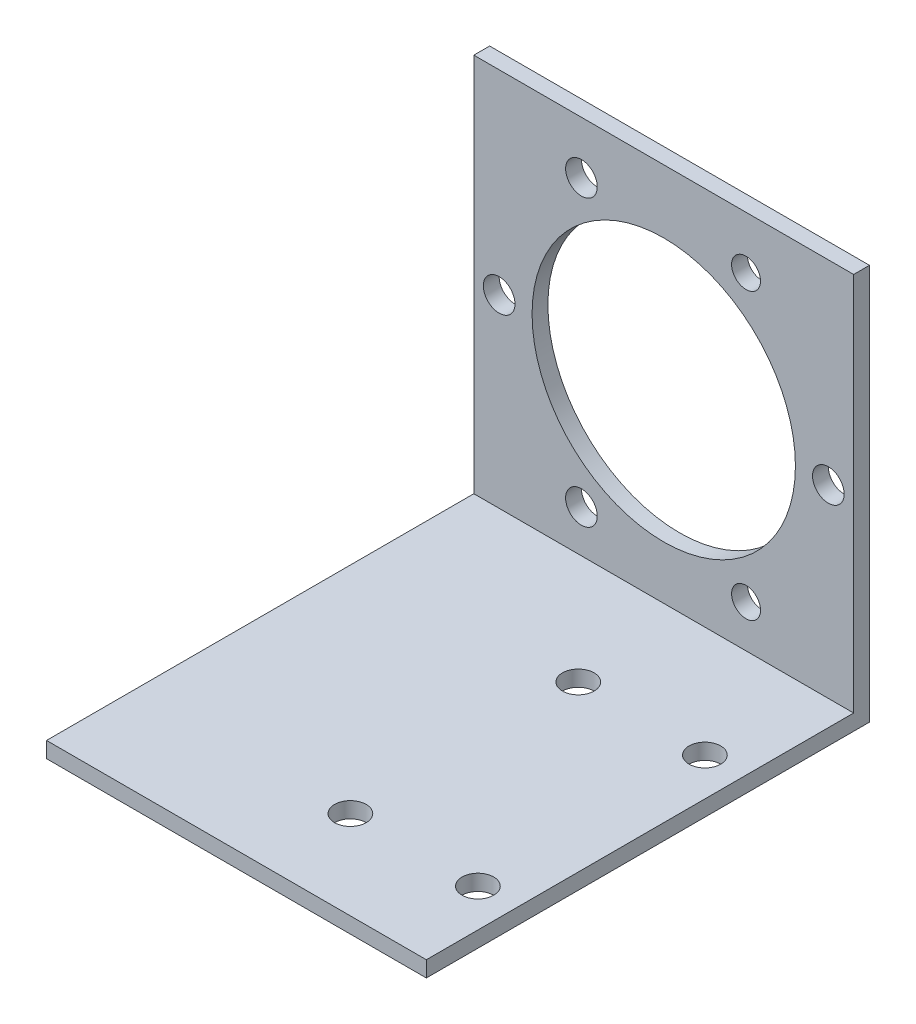
ISO-10303-21;
HEADER;
FILE_DESCRIPTION(('STEP AP214'),'2;1');
FILE_NAME('part.step','',(''),(''),'','','');
FILE_SCHEMA(('AUTOMOTIVE_DESIGN { 1 0 10303 214 1 1 1 1 }'));
ENDSEC;
DATA;
#1=APPLICATION_CONTEXT('core data for automotive mechanical design processes');
#2=APPLICATION_PROTOCOL_DEFINITION('international standard','automotive_design',2000,#1);
#3=PRODUCT_CONTEXT('',#1,'mechanical');
#4=PRODUCT('Part','Part','',(#3));
#5=PRODUCT_RELATED_PRODUCT_CATEGORY('part','',(#4));
#6=PRODUCT_DEFINITION_FORMATION('','',#4);
#7=PRODUCT_DEFINITION_CONTEXT('part definition',#1,'design');
#8=PRODUCT_DEFINITION('design','',#6,#7);
#9=PRODUCT_DEFINITION_SHAPE('','',#8);
#10=(LENGTH_UNIT() NAMED_UNIT(*) SI_UNIT(.MILLI.,.METRE.));
#11=(NAMED_UNIT(*) PLANE_ANGLE_UNIT() SI_UNIT($,.RADIAN.));
#12=(NAMED_UNIT(*) SI_UNIT($,.STERADIAN.) SOLID_ANGLE_UNIT());
#13=UNCERTAINTY_MEASURE_WITH_UNIT(LENGTH_MEASURE(1.E-05),#10,'distance_accuracy_value','');
#14=(GEOMETRIC_REPRESENTATION_CONTEXT(3) GLOBAL_UNCERTAINTY_ASSIGNED_CONTEXT((#13)) GLOBAL_UNIT_ASSIGNED_CONTEXT((#10,
#11,#12)) REPRESENTATION_CONTEXT('',''));
#15=CARTESIAN_POINT('',(0.,0.,0.));
#16=DIRECTION('',(0.,0.,1.));
#17=DIRECTION('',(1.,0.,0.));
#18=AXIS2_PLACEMENT_3D('',#15,#16,#17);
#19=CARTESIAN_POINT('',(0.,1.58749999999999,44.4499999999998));
#20=DIRECTION('',(0.,-1.,0.));
#21=DIRECTION('',(0.,0.,-1.));
#22=AXIS2_PLACEMENT_3D('',#19,#20,#21);
#23=PLANE('',#22);
#24=CARTESIAN_POINT('',(34.29,1.58750000000001,12.7));
#25=DIRECTION('',(0.,1.,0.));
#26=DIRECTION('',(0.,0.,1.));
#27=AXIS2_PLACEMENT_3D('',#24,#25,#26);
#28=CIRCLE('',#27,1.58749999999999);
#29=CARTESIAN_POINT('',(34.29,1.58750000000001,14.2875));
#30=VERTEX_POINT('',#29);
#31=EDGE_CURVE('E268',#30,#30,#28,.T.);
#32=ORIENTED_EDGE('',*,*,#31,.F.);
#33=EDGE_LOOP('',(#32));
#34=FACE_BOUND('',#33,.T.);
#35=CARTESIAN_POINT('',(21.59,1.58750000000001,12.7));
#36=DIRECTION('',(0.,1.,0.));
#37=DIRECTION('',(0.,0.,1.));
#38=AXIS2_PLACEMENT_3D('',#35,#36,#37);
#39=CIRCLE('',#38,1.58749999999999);
#40=CARTESIAN_POINT('',(21.59,1.58750000000001,14.2875));
#41=VERTEX_POINT('',#40);
#42=EDGE_CURVE('E273',#41,#41,#39,.T.);
#43=ORIENTED_EDGE('',*,*,#42,.F.);
#44=EDGE_LOOP('',(#43));
#45=FACE_BOUND('',#44,.T.);
#46=CARTESIAN_POINT('',(21.59,1.58749999999999,35.56));
#47=DIRECTION('',(0.,1.,0.));
#48=DIRECTION('',(0.,0.,1.));
#49=AXIS2_PLACEMENT_3D('',#46,#47,#48);
#50=CIRCLE('',#49,1.58749999999999);
#51=CARTESIAN_POINT('',(21.59,1.58749999999999,37.1475));
#52=VERTEX_POINT('',#51);
#53=EDGE_CURVE('E279',#52,#52,#50,.T.);
#54=ORIENTED_EDGE('',*,*,#53,.F.);
#55=EDGE_LOOP('',(#54));
#56=FACE_BOUND('',#55,.T.);
#57=CARTESIAN_POINT('',(34.29,1.58749999999999,35.4699303706849));
#58=DIRECTION('',(0.,1.,0.));
#59=DIRECTION('',(0.,0.,1.));
#60=AXIS2_PLACEMENT_3D('',#57,#58,#59);
#61=CIRCLE('',#60,1.58749999999999);
#62=CARTESIAN_POINT('',(34.29,1.58749999999999,37.0574303706849));
#63=VERTEX_POINT('',#62);
#64=EDGE_CURVE('E285',#63,#63,#61,.T.);
#65=ORIENTED_EDGE('',*,*,#64,.F.);
#66=EDGE_LOOP('',(#65));
#67=FACE_BOUND('',#66,.T.);
#68=DIRECTION('',(1.,0.,0.));
#69=VECTOR('',#68,1.);
#70=CARTESIAN_POINT('',(0.,1.58750000000001,1.58749999999999));
#71=LINE('',#70,#69);
#72=CARTESIAN_POINT('',(0.,1.58750000000001,1.58749999999999));
#73=VERTEX_POINT('',#72);
#74=CARTESIAN_POINT('',(38.1,1.58750000000001,1.58749999999999));
#75=VERTEX_POINT('',#74);
#76=EDGE_CURVE('E53',#73,#75,#71,.T.);
#77=ORIENTED_EDGE('',*,*,#76,.F.);
#78=DIRECTION('',(0.,0.,-1.));
#79=VECTOR('',#78,1.);
#80=CARTESIAN_POINT('',(0.,1.58749999999999,44.4499999999998));
#81=LINE('',#80,#79);
#82=CARTESIAN_POINT('',(0.,1.58749999999999,44.4499999999998));
#83=VERTEX_POINT('',#82);
#84=EDGE_CURVE('E119',#83,#73,#81,.T.);
#85=ORIENTED_EDGE('',*,*,#84,.F.);
#86=DIRECTION('',(-1.,0.,0.));
#87=VECTOR('',#86,1.);
#88=CARTESIAN_POINT('',(0.,1.58749999999999,44.4499999999998));
#89=LINE('',#88,#87);
#90=CARTESIAN_POINT('',(38.1,1.58749999999999,44.4499999999998));
#91=VERTEX_POINT('',#90);
#92=EDGE_CURVE('E62',#91,#83,#89,.T.);
#93=ORIENTED_EDGE('',*,*,#92,.F.);
#94=DIRECTION('',(0.,0.,-1.));
#95=VECTOR('',#94,1.);
#96=CARTESIAN_POINT('',(38.1,1.58749999999999,44.4499999999998));
#97=LINE('',#96,#95);
#98=EDGE_CURVE('E136',#91,#75,#97,.T.);
#99=ORIENTED_EDGE('',*,*,#98,.T.);
#100=EDGE_LOOP('',(#77,#85,#93,#99));
#101=FACE_BOUND('',#100,.T.);
#102=ADVANCED_FACE('F36',(#34,#45,#56,#67,#101),#23,.F.);
#103=CARTESIAN_POINT('',(0.,0.,44.4499999999998));
#104=DIRECTION('',(1.,0.,0.));
#105=DIRECTION('',(0.,0.,-1.));
#106=AXIS2_PLACEMENT_3D('',#103,#104,#105);
#107=PLANE('',#106);
#108=DIRECTION('',(0.,-1.,0.));
#109=VECTOR('',#108,1.);
#110=CARTESIAN_POINT('',(0.,0.,0.));
#111=LINE('',#110,#109);
#112=CARTESIAN_POINT('',(0.,39.6875,-4.16333634234434E-13));
#113=VERTEX_POINT('',#112);
#114=CARTESIAN_POINT('',(0.,0.,0.));
#115=VERTEX_POINT('',#114);
#116=EDGE_CURVE('E120',#113,#115,#111,.T.);
#117=ORIENTED_EDGE('',*,*,#116,.T.);
#118=DIRECTION('',(0.,0.,-1.));
#119=VECTOR('',#118,1.);
#120=CARTESIAN_POINT('',(0.,0.,44.4499999999998));
#121=LINE('',#120,#119);
#122=CARTESIAN_POINT('',(0.,0.,44.4499999999998));
#123=VERTEX_POINT('',#122);
#124=EDGE_CURVE('E11',#123,#115,#121,.T.);
#125=ORIENTED_EDGE('',*,*,#124,.F.);
#126=DIRECTION('',(0.,-1.,0.));
#127=VECTOR('',#126,1.);
#128=CARTESIAN_POINT('',(0.,0.,44.4499999999998));
#129=LINE('',#128,#127);
#130=EDGE_CURVE('E126',#83,#123,#129,.T.);
#131=ORIENTED_EDGE('',*,*,#130,.F.);
#132=ORIENTED_EDGE('',*,*,#84,.T.);
#133=DIRECTION('',(0.,-1.,0.));
#134=VECTOR('',#133,1.);
#135=CARTESIAN_POINT('',(0.,39.6875,1.58749999999958));
#136=LINE('',#135,#134);
#137=CARTESIAN_POINT('',(0.,39.6875,1.58749999999958));
#138=VERTEX_POINT('',#137);
#139=EDGE_CURVE('E101',#138,#73,#136,.T.);
#140=ORIENTED_EDGE('',*,*,#139,.F.);
#141=DIRECTION('',(0.,0.,1.));
#142=VECTOR('',#141,1.);
#143=CARTESIAN_POINT('',(0.,39.6875,-4.16333634234434E-13));
#144=LINE('',#143,#142);
#145=EDGE_CURVE('E108',#113,#138,#144,.T.);
#146=ORIENTED_EDGE('',*,*,#145,.F.);
#147=EDGE_LOOP('',(#117,#125,#131,#132,#140,#146));
#148=FACE_BOUND('',#147,.T.);
#149=ADVANCED_FACE('F38',(#148),#107,.F.);
#150=CARTESIAN_POINT('',(0.,0.,44.4499999999998));
#151=DIRECTION('',(0.,1.,0.));
#152=DIRECTION('',(0.,0.,1.));
#153=AXIS2_PLACEMENT_3D('',#150,#151,#152);
#154=PLANE('',#153);
#155=CARTESIAN_POINT('',(34.29,0.,12.7));
#156=DIRECTION('',(0.,1.,0.));
#157=DIRECTION('',(0.,0.,1.));
#158=AXIS2_PLACEMENT_3D('',#155,#156,#157);
#159=CIRCLE('',#158,1.5875);
#160=CARTESIAN_POINT('',(34.29,0.,14.2875));
#161=VERTEX_POINT('',#160);
#162=EDGE_CURVE('E271',#161,#161,#159,.T.);
#163=ORIENTED_EDGE('',*,*,#162,.T.);
#164=EDGE_LOOP('',(#163));
#165=FACE_BOUND('',#164,.T.);
#166=CARTESIAN_POINT('',(21.59,0.,12.7));
#167=DIRECTION('',(0.,1.,0.));
#168=DIRECTION('',(0.,0.,1.));
#169=AXIS2_PLACEMENT_3D('',#166,#167,#168);
#170=CIRCLE('',#169,1.5875);
#171=CARTESIAN_POINT('',(21.59,0.,14.2875));
#172=VERTEX_POINT('',#171);
#173=EDGE_CURVE('E276',#172,#172,#170,.T.);
#174=ORIENTED_EDGE('',*,*,#173,.T.);
#175=EDGE_LOOP('',(#174));
#176=FACE_BOUND('',#175,.T.);
#177=CARTESIAN_POINT('',(21.59,0.,35.56));
#178=DIRECTION('',(0.,1.,0.));
#179=DIRECTION('',(0.,0.,1.));
#180=AXIS2_PLACEMENT_3D('',#177,#178,#179);
#181=CIRCLE('',#180,1.5875);
#182=CARTESIAN_POINT('',(21.59,0.,37.1475));
#183=VERTEX_POINT('',#182);
#184=EDGE_CURVE('E282',#183,#183,#181,.T.);
#185=ORIENTED_EDGE('',*,*,#184,.T.);
#186=EDGE_LOOP('',(#185));
#187=FACE_BOUND('',#186,.T.);
#188=CARTESIAN_POINT('',(34.29,0.,35.4699303706849));
#189=DIRECTION('',(0.,1.,0.));
#190=DIRECTION('',(0.,0.,1.));
#191=AXIS2_PLACEMENT_3D('',#188,#189,#190);
#192=CIRCLE('',#191,1.5875);
#193=CARTESIAN_POINT('',(34.29,0.,37.0574303706849));
#194=VERTEX_POINT('',#193);
#195=EDGE_CURVE('E287',#194,#194,#192,.T.);
#196=ORIENTED_EDGE('',*,*,#195,.T.);
#197=EDGE_LOOP('',(#196));
#198=FACE_BOUND('',#197,.T.);
#199=DIRECTION('',(1.,0.,0.));
#200=VECTOR('',#199,1.);
#201=CARTESIAN_POINT('',(0.,0.,0.));
#202=LINE('',#201,#200);
#203=CARTESIAN_POINT('',(38.1,0.,0.));
#204=VERTEX_POINT('',#203);
#205=EDGE_CURVE('E75',#115,#204,#202,.T.);
#206=ORIENTED_EDGE('',*,*,#205,.T.);
#207=DIRECTION('',(0.,0.,-1.));
#208=VECTOR('',#207,1.);
#209=CARTESIAN_POINT('',(38.1,0.,44.4499999999998));
#210=LINE('',#209,#208);
#211=CARTESIAN_POINT('',(38.1,0.,44.4499999999998));
#212=VERTEX_POINT('',#211);
#213=EDGE_CURVE('E45',#212,#204,#210,.T.);
#214=ORIENTED_EDGE('',*,*,#213,.F.);
#215=DIRECTION('',(1.,0.,0.));
#216=VECTOR('',#215,1.);
#217=CARTESIAN_POINT('',(0.,0.,44.4499999999998));
#218=LINE('',#217,#216);
#219=EDGE_CURVE('E80',#123,#212,#218,.T.);
#220=ORIENTED_EDGE('',*,*,#219,.F.);
#221=ORIENTED_EDGE('',*,*,#124,.T.);
#222=EDGE_LOOP('',(#206,#214,#220,#221));
#223=FACE_BOUND('',#222,.T.);
#224=ADVANCED_FACE('F179',(#165,#176,#187,#198,#223),#154,.F.);
#225=CARTESIAN_POINT('',(38.1,0.,44.4499999999998));
#226=DIRECTION('',(-1.,0.,0.));
#227=DIRECTION('',(0.,0.,1.));
#228=AXIS2_PLACEMENT_3D('',#225,#226,#227);
#229=PLANE('',#228);
#230=DIRECTION('',(0.,1.,0.));
#231=VECTOR('',#230,1.);
#232=CARTESIAN_POINT('',(38.1,0.,0.));
#233=LINE('',#232,#231);
#234=CARTESIAN_POINT('',(38.1,39.6875,-4.16333634234434E-13));
#235=VERTEX_POINT('',#234);
#236=EDGE_CURVE('E128',#204,#235,#233,.T.);
#237=ORIENTED_EDGE('',*,*,#236,.T.);
#238=DIRECTION('',(0.,0.,-1.));
#239=VECTOR('',#238,1.);
#240=CARTESIAN_POINT('',(38.1,39.6875,-4.16333634234434E-13));
#241=LINE('',#240,#239);
#242=CARTESIAN_POINT('',(38.1,39.6875,1.58749999999958));
#243=VERTEX_POINT('',#242);
#244=EDGE_CURVE('E107',#243,#235,#241,.T.);
#245=ORIENTED_EDGE('',*,*,#244,.F.);
#246=DIRECTION('',(0.,-1.,0.));
#247=VECTOR('',#246,1.);
#248=CARTESIAN_POINT('',(38.1,39.6875,1.58749999999958));
#249=LINE('',#248,#247);
#250=EDGE_CURVE('E103',#243,#75,#249,.T.);
#251=ORIENTED_EDGE('',*,*,#250,.T.);
#252=ORIENTED_EDGE('',*,*,#98,.F.);
#253=DIRECTION('',(0.,1.,0.));
#254=VECTOR('',#253,1.);
#255=CARTESIAN_POINT('',(38.1,0.,44.4499999999998));
#256=LINE('',#255,#254);
#257=EDGE_CURVE('E130',#212,#91,#256,.T.);
#258=ORIENTED_EDGE('',*,*,#257,.F.);
#259=ORIENTED_EDGE('',*,*,#213,.T.);
#260=EDGE_LOOP('',(#237,#245,#251,#252,#258,#259));
#261=FACE_BOUND('',#260,.T.);
#262=ADVANCED_FACE('F173',(#261),#229,.F.);
#263=CARTESIAN_POINT('',(0.,0.,44.4499999999998));
#264=DIRECTION('',(0.,0.,-1.));
#265=DIRECTION('',(-1.,0.,0.));
#266=AXIS2_PLACEMENT_3D('',#263,#264,#265);
#267=PLANE('',#266);
#268=ORIENTED_EDGE('',*,*,#130,.T.);
#269=ORIENTED_EDGE('',*,*,#219,.T.);
#270=ORIENTED_EDGE('',*,*,#257,.T.);
#271=ORIENTED_EDGE('',*,*,#92,.T.);
#272=EDGE_LOOP('',(#268,#269,#270,#271));
#273=FACE_BOUND('',#272,.T.);
#274=ADVANCED_FACE('F186',(#273),#267,.F.);
#275=CARTESIAN_POINT('',(0.,0.,0.));
#276=DIRECTION('',(0.,0.,-1.));
#277=DIRECTION('',(-1.,0.,0.));
#278=AXIS2_PLACEMENT_3D('',#275,#276,#277);
#279=PLANE('',#278);
#280=CARTESIAN_POINT('',(27.3050000000001,5.83142058351896,0.));
#281=DIRECTION('',(0.,0.,-1.));
#282=DIRECTION('',(-1.,0.,0.));
#283=AXIS2_PLACEMENT_3D('',#280,#281,#282);
#284=CIRCLE('',#283,1.44999999999999);
#285=CARTESIAN_POINT('',(25.8550000000001,5.83142058351896,0.));
#286=VERTEX_POINT('',#285);
#287=EDGE_CURVE('E255',#286,#286,#284,.T.);
#288=ORIENTED_EDGE('',*,*,#287,.F.);
#289=EDGE_LOOP('',(#288));
#290=FACE_BOUND('',#289,.T.);
#291=CARTESIAN_POINT('',(27.3050000000001,34.427579416481,-4.16333634234434E-13));
#292=DIRECTION('',(0.,0.,-1.));
#293=DIRECTION('',(-1.,0.,0.));
#294=AXIS2_PLACEMENT_3D('',#291,#292,#293);
#295=CIRCLE('',#294,1.44999999999999);
#296=CARTESIAN_POINT('',(25.8550000000001,34.427579416481,-4.16333634234443E-13));
#297=VERTEX_POINT('',#296);
#298=EDGE_CURVE('E259',#297,#297,#295,.T.);
#299=ORIENTED_EDGE('',*,*,#298,.F.);
#300=EDGE_LOOP('',(#299));
#301=FACE_BOUND('',#300,.T.);
#302=CARTESIAN_POINT('',(35.56,20.1295,-4.16333634234434E-13));
#303=DIRECTION('',(0.,0.,-1.));
#304=DIRECTION('',(-1.,0.,0.));
#305=AXIS2_PLACEMENT_3D('',#302,#303,#304);
#306=CIRCLE('',#305,1.5875);
#307=CARTESIAN_POINT('',(33.9725,20.1295,-4.16333634234444E-13));
#308=VERTEX_POINT('',#307);
#309=EDGE_CURVE('E159',#308,#308,#306,.T.);
#310=ORIENTED_EDGE('',*,*,#309,.F.);
#311=EDGE_LOOP('',(#310));
#312=FACE_BOUND('',#311,.T.);
#313=CARTESIAN_POINT('',(10.795,34.4275794164811,-4.16333634234434E-13));
#314=DIRECTION('',(0.,0.,-1.));
#315=DIRECTION('',(-1.,0.,0.));
#316=AXIS2_PLACEMENT_3D('',#313,#314,#315);
#317=CIRCLE('',#316,1.5875);
#318=CARTESIAN_POINT('',(9.20750000000003,34.4275794164811,-4.16333634234444E-13));
#319=VERTEX_POINT('',#318);
#320=EDGE_CURVE('E149',#319,#319,#317,.T.);
#321=ORIENTED_EDGE('',*,*,#320,.F.);
#322=EDGE_LOOP('',(#321));
#323=FACE_BOUND('',#322,.T.);
#324=CARTESIAN_POINT('',(2.54,20.1295,-4.16333634234434E-13));
#325=DIRECTION('',(0.,0.,-1.));
#326=DIRECTION('',(-1.,0.,0.));
#327=AXIS2_PLACEMENT_3D('',#324,#325,#326);
#328=CIRCLE('',#327,1.5875);
#329=CARTESIAN_POINT('',(0.952500000000001,20.1295,-4.16333634234444E-13));
#330=VERTEX_POINT('',#329);
#331=EDGE_CURVE('E146',#330,#330,#328,.T.);
#332=ORIENTED_EDGE('',*,*,#331,.F.);
#333=EDGE_LOOP('',(#332));
#334=FACE_BOUND('',#333,.T.);
#335=CARTESIAN_POINT('',(10.795,5.8314205835189,0.));
#336=DIRECTION('',(0.,0.,-1.));
#337=DIRECTION('',(-1.,0.,0.));
#338=AXIS2_PLACEMENT_3D('',#335,#336,#337);
#339=CIRCLE('',#338,1.5875);
#340=CARTESIAN_POINT('',(9.20750000000003,5.8314205835189,0.));
#341=VERTEX_POINT('',#340);
#342=EDGE_CURVE('E145',#341,#341,#339,.T.);
#343=ORIENTED_EDGE('',*,*,#342,.F.);
#344=EDGE_LOOP('',(#343));
#345=FACE_BOUND('',#344,.T.);
#346=CARTESIAN_POINT('',(19.05,20.1295,-4.16333634234434E-13));
#347=DIRECTION('',(0.,0.,-1.));
#348=DIRECTION('',(-1.,0.,0.));
#349=AXIS2_PLACEMENT_3D('',#346,#347,#348);
#350=CIRCLE('',#349,13.208);
#351=CARTESIAN_POINT('',(5.842,20.1295,-4.16333634234519E-13));
#352=VERTEX_POINT('',#351);
#353=EDGE_CURVE('E142',#352,#352,#350,.T.);
#354=ORIENTED_EDGE('',*,*,#353,.F.);
#355=EDGE_LOOP('',(#354));
#356=FACE_BOUND('',#355,.T.);
#357=ORIENTED_EDGE('',*,*,#116,.F.);
#358=DIRECTION('',(-1.,0.,0.));
#359=VECTOR('',#358,1.);
#360=CARTESIAN_POINT('',(0.,39.6875,-4.16333634234434E-13));
#361=LINE('',#360,#359);
#362=EDGE_CURVE('E114',#235,#113,#361,.T.);
#363=ORIENTED_EDGE('',*,*,#362,.F.);
#364=ORIENTED_EDGE('',*,*,#236,.F.);
#365=ORIENTED_EDGE('',*,*,#205,.F.);
#366=EDGE_LOOP('',(#357,#363,#364,#365));
#367=FACE_BOUND('',#366,.T.);
#368=ADVANCED_FACE('F177',(#290,#301,#312,#323,#334,#345,#356,#367),#279,.T.);
#369=CARTESIAN_POINT('',(0.,39.6875,1.58749999999958));
#370=DIRECTION('',(0.,0.,-1.));
#371=DIRECTION('',(-1.,0.,0.));
#372=AXIS2_PLACEMENT_3D('',#369,#370,#371);
#373=PLANE('',#372);
#374=CARTESIAN_POINT('',(27.3050000000001,5.83142058351896,1.58749999999999));
#375=DIRECTION('',(0.,0.,-1.));
#376=DIRECTION('',(-1.,0.,0.));
#377=AXIS2_PLACEMENT_3D('',#374,#375,#376);
#378=CIRCLE('',#377,1.44999999999999);
#379=CARTESIAN_POINT('',(25.8550000000001,5.83142058351896,1.58749999999999));
#380=VERTEX_POINT('',#379);
#381=EDGE_CURVE('E258',#380,#380,#378,.T.);
#382=ORIENTED_EDGE('',*,*,#381,.T.);
#383=EDGE_LOOP('',(#382));
#384=FACE_BOUND('',#383,.T.);
#385=CARTESIAN_POINT('',(27.3050000000001,34.427579416481,1.58749999999958));
#386=DIRECTION('',(0.,0.,-1.));
#387=DIRECTION('',(-1.,0.,0.));
#388=AXIS2_PLACEMENT_3D('',#385,#386,#387);
#389=CIRCLE('',#388,1.44999999999999);
#390=CARTESIAN_POINT('',(25.8550000000001,34.427579416481,1.58749999999958));
#391=VERTEX_POINT('',#390);
#392=EDGE_CURVE('E262',#391,#391,#389,.T.);
#393=ORIENTED_EDGE('',*,*,#392,.T.);
#394=EDGE_LOOP('',(#393));
#395=FACE_BOUND('',#394,.T.);
#396=CARTESIAN_POINT('',(35.56,20.1295,1.58749999999958));
#397=DIRECTION('',(0.,0.,-1.));
#398=DIRECTION('',(-1.,0.,0.));
#399=AXIS2_PLACEMENT_3D('',#396,#397,#398);
#400=CIRCLE('',#399,1.58749999999999);
#401=CARTESIAN_POINT('',(33.9725,20.1295,1.58749999999958));
#402=VERTEX_POINT('',#401);
#403=EDGE_CURVE('E40',#402,#402,#400,.T.);
#404=ORIENTED_EDGE('',*,*,#403,.T.);
#405=EDGE_LOOP('',(#404));
#406=FACE_BOUND('',#405,.T.);
#407=CARTESIAN_POINT('',(10.795,34.4275794164811,1.58749999999958));
#408=DIRECTION('',(0.,0.,-1.));
#409=DIRECTION('',(-1.,0.,0.));
#410=AXIS2_PLACEMENT_3D('',#407,#408,#409);
#411=CIRCLE('',#410,1.58749999999999);
#412=CARTESIAN_POINT('',(9.20750000000003,34.4275794164811,1.58749999999958));
#413=VERTEX_POINT('',#412);
#414=EDGE_CURVE('E147',#413,#413,#411,.T.);
#415=ORIENTED_EDGE('',*,*,#414,.T.);
#416=EDGE_LOOP('',(#415));
#417=FACE_BOUND('',#416,.T.);
#418=CARTESIAN_POINT('',(2.54,20.1295,1.58749999999958));
#419=DIRECTION('',(0.,0.,-1.));
#420=DIRECTION('',(-1.,0.,0.));
#421=AXIS2_PLACEMENT_3D('',#418,#419,#420);
#422=CIRCLE('',#421,1.58749999999999);
#423=CARTESIAN_POINT('',(0.952500000000007,20.1295,1.58749999999958));
#424=VERTEX_POINT('',#423);
#425=EDGE_CURVE('E143',#424,#424,#422,.T.);
#426=ORIENTED_EDGE('',*,*,#425,.T.);
#427=EDGE_LOOP('',(#426));
#428=FACE_BOUND('',#427,.T.);
#429=CARTESIAN_POINT('',(10.795,5.8314205835189,1.58749999999999));
#430=DIRECTION('',(0.,0.,-1.));
#431=DIRECTION('',(-1.,0.,0.));
#432=AXIS2_PLACEMENT_3D('',#429,#430,#431);
#433=CIRCLE('',#432,1.58749999999999);
#434=CARTESIAN_POINT('',(9.20750000000003,5.8314205835189,1.58749999999999));
#435=VERTEX_POINT('',#434);
#436=EDGE_CURVE('E165',#435,#435,#433,.T.);
#437=ORIENTED_EDGE('',*,*,#436,.T.);
#438=EDGE_LOOP('',(#437));
#439=FACE_BOUND('',#438,.T.);
#440=CARTESIAN_POINT('',(19.05,20.1295,1.58749999999958));
#441=DIRECTION('',(0.,0.,-1.));
#442=DIRECTION('',(-1.,0.,0.));
#443=AXIS2_PLACEMENT_3D('',#440,#441,#442);
#444=CIRCLE('',#443,13.208);
#445=CARTESIAN_POINT('',(5.842,20.1295,1.58749999999958));
#446=VERTEX_POINT('',#445);
#447=EDGE_CURVE('E139',#446,#446,#444,.T.);
#448=ORIENTED_EDGE('',*,*,#447,.T.);
#449=EDGE_LOOP('',(#448));
#450=FACE_BOUND('',#449,.T.);
#451=ORIENTED_EDGE('',*,*,#76,.T.);
#452=ORIENTED_EDGE('',*,*,#250,.F.);
#453=DIRECTION('',(1.,0.,0.));
#454=VECTOR('',#453,1.);
#455=CARTESIAN_POINT('',(0.,39.6875,1.58749999999958));
#456=LINE('',#455,#454);
#457=EDGE_CURVE('E97',#138,#243,#456,.T.);
#458=ORIENTED_EDGE('',*,*,#457,.F.);
#459=ORIENTED_EDGE('',*,*,#139,.T.);
#460=EDGE_LOOP('',(#451,#452,#458,#459));
#461=FACE_BOUND('',#460,.T.);
#462=ADVANCED_FACE('F99',(#384,#395,#406,#417,#428,#439,#450,#461),#373,.F.);
#463=CARTESIAN_POINT('',(0.,39.6875,-4.16333634234434E-13));
#464=DIRECTION('',(0.,1.,0.));
#465=DIRECTION('',(0.,0.,1.));
#466=AXIS2_PLACEMENT_3D('',#463,#464,#465);
#467=PLANE('',#466);
#468=ORIENTED_EDGE('',*,*,#145,.T.);
#469=ORIENTED_EDGE('',*,*,#457,.T.);
#470=ORIENTED_EDGE('',*,*,#244,.T.);
#471=ORIENTED_EDGE('',*,*,#362,.T.);
#472=EDGE_LOOP('',(#468,#469,#470,#471));
#473=FACE_BOUND('',#472,.T.);
#474=ADVANCED_FACE('F112',(#473),#467,.T.);
#475=CARTESIAN_POINT('',(19.05,20.1295,44.4499999999998));
#476=DIRECTION('',(0.,0.,-1.));
#477=DIRECTION('',(-1.,0.,0.));
#478=AXIS2_PLACEMENT_3D('',#475,#476,#477);
#479=CYLINDRICAL_SURFACE('',#478,13.208);
#480=ORIENTED_EDGE('',*,*,#353,.T.);
#481=EDGE_LOOP('',(#480));
#482=FACE_BOUND('',#481,.T.);
#483=ORIENTED_EDGE('',*,*,#447,.F.);
#484=EDGE_LOOP('',(#483));
#485=FACE_BOUND('',#484,.T.);
#486=ADVANCED_FACE('F208',(#482,#485),#479,.F.);
#487=CARTESIAN_POINT('',(10.795,5.8314205835189,0.));
#488=DIRECTION('',(0.,0.,-1.));
#489=DIRECTION('',(-1.,0.,0.));
#490=AXIS2_PLACEMENT_3D('',#487,#488,#489);
#491=CYLINDRICAL_SURFACE('',#490,1.58749999999999);
#492=ORIENTED_EDGE('',*,*,#342,.T.);
#493=EDGE_LOOP('',(#492));
#494=FACE_BOUND('',#493,.T.);
#495=ORIENTED_EDGE('',*,*,#436,.F.);
#496=EDGE_LOOP('',(#495));
#497=FACE_BOUND('',#496,.T.);
#498=ADVANCED_FACE('F211',(#494,#497),#491,.F.);
#499=CARTESIAN_POINT('',(2.54,20.1295,-4.16333634234434E-13));
#500=DIRECTION('',(0.,0.,-1.));
#501=DIRECTION('',(-1.,0.,0.));
#502=AXIS2_PLACEMENT_3D('',#499,#500,#501);
#503=CYLINDRICAL_SURFACE('',#502,1.58749999999999);
#504=ORIENTED_EDGE('',*,*,#331,.T.);
#505=EDGE_LOOP('',(#504));
#506=FACE_BOUND('',#505,.T.);
#507=ORIENTED_EDGE('',*,*,#425,.F.);
#508=EDGE_LOOP('',(#507));
#509=FACE_BOUND('',#508,.T.);
#510=ADVANCED_FACE('F215',(#506,#509),#503,.F.);
#511=CARTESIAN_POINT('',(10.795,34.4275794164811,-4.16333634234434E-13));
#512=DIRECTION('',(0.,0.,-1.));
#513=DIRECTION('',(-1.,0.,0.));
#514=AXIS2_PLACEMENT_3D('',#511,#512,#513);
#515=CYLINDRICAL_SURFACE('',#514,1.58749999999999);
#516=ORIENTED_EDGE('',*,*,#320,.T.);
#517=EDGE_LOOP('',(#516));
#518=FACE_BOUND('',#517,.T.);
#519=ORIENTED_EDGE('',*,*,#414,.F.);
#520=EDGE_LOOP('',(#519));
#521=FACE_BOUND('',#520,.T.);
#522=ADVANCED_FACE('F219',(#518,#521),#515,.F.);
#523=CARTESIAN_POINT('',(35.56,20.1295,-4.16333634234434E-13));
#524=DIRECTION('',(0.,0.,-1.));
#525=DIRECTION('',(-1.,0.,0.));
#526=AXIS2_PLACEMENT_3D('',#523,#524,#525);
#527=CYLINDRICAL_SURFACE('',#526,1.58749999999999);
#528=ORIENTED_EDGE('',*,*,#309,.T.);
#529=EDGE_LOOP('',(#528));
#530=FACE_BOUND('',#529,.T.);
#531=ORIENTED_EDGE('',*,*,#403,.F.);
#532=EDGE_LOOP('',(#531));
#533=FACE_BOUND('',#532,.T.);
#534=ADVANCED_FACE('F223',(#530,#533),#527,.F.);
#535=CARTESIAN_POINT('',(34.29,1.58749999999999,35.4699303706849));
#536=DIRECTION('',(0.,1.,0.));
#537=DIRECTION('',(0.,0.,1.));
#538=AXIS2_PLACEMENT_3D('',#535,#536,#537);
#539=CYLINDRICAL_SURFACE('',#538,1.5875);
#540=ORIENTED_EDGE('',*,*,#195,.F.);
#541=EDGE_LOOP('',(#540));
#542=FACE_BOUND('',#541,.T.);
#543=ORIENTED_EDGE('',*,*,#64,.T.);
#544=EDGE_LOOP('',(#543));
#545=FACE_BOUND('',#544,.T.);
#546=ADVANCED_FACE('F226',(#542,#545),#539,.F.);
#547=CARTESIAN_POINT('',(21.59,1.58749999999999,35.56));
#548=DIRECTION('',(0.,1.,0.));
#549=DIRECTION('',(0.,0.,1.));
#550=AXIS2_PLACEMENT_3D('',#547,#548,#549);
#551=CYLINDRICAL_SURFACE('',#550,1.58749999999999);
#552=ORIENTED_EDGE('',*,*,#184,.F.);
#553=EDGE_LOOP('',(#552));
#554=FACE_BOUND('',#553,.T.);
#555=ORIENTED_EDGE('',*,*,#53,.T.);
#556=EDGE_LOOP('',(#555));
#557=FACE_BOUND('',#556,.T.);
#558=ADVANCED_FACE('F230',(#554,#557),#551,.F.);
#559=CARTESIAN_POINT('',(21.59,1.58750000000001,12.7));
#560=DIRECTION('',(0.,1.,0.));
#561=DIRECTION('',(0.,0.,1.));
#562=AXIS2_PLACEMENT_3D('',#559,#560,#561);
#563=CYLINDRICAL_SURFACE('',#562,1.58749999999999);
#564=ORIENTED_EDGE('',*,*,#173,.F.);
#565=EDGE_LOOP('',(#564));
#566=FACE_BOUND('',#565,.T.);
#567=ORIENTED_EDGE('',*,*,#42,.T.);
#568=EDGE_LOOP('',(#567));
#569=FACE_BOUND('',#568,.T.);
#570=ADVANCED_FACE('F234',(#566,#569),#563,.F.);
#571=CARTESIAN_POINT('',(34.29,1.58750000000001,12.7));
#572=DIRECTION('',(0.,1.,0.));
#573=DIRECTION('',(0.,0.,1.));
#574=AXIS2_PLACEMENT_3D('',#571,#572,#573);
#575=CYLINDRICAL_SURFACE('',#574,1.5875);
#576=ORIENTED_EDGE('',*,*,#162,.F.);
#577=EDGE_LOOP('',(#576));
#578=FACE_BOUND('',#577,.T.);
#579=ORIENTED_EDGE('',*,*,#31,.T.);
#580=EDGE_LOOP('',(#579));
#581=FACE_BOUND('',#580,.T.);
#582=ADVANCED_FACE('F238',(#578,#581),#575,.F.);
#583=CARTESIAN_POINT('',(27.3050000000001,34.427579416481,-4.16333634234434E-13));
#584=DIRECTION('',(0.,0.,-1.));
#585=DIRECTION('',(-1.,0.,0.));
#586=AXIS2_PLACEMENT_3D('',#583,#584,#585);
#587=CYLINDRICAL_SURFACE('',#586,1.44999999999999);
#588=ORIENTED_EDGE('',*,*,#298,.T.);
#589=EDGE_LOOP('',(#588));
#590=FACE_BOUND('',#589,.T.);
#591=ORIENTED_EDGE('',*,*,#392,.F.);
#592=EDGE_LOOP('',(#591));
#593=FACE_BOUND('',#592,.T.);
#594=ADVANCED_FACE('F242',(#590,#593),#587,.F.);
#595=CARTESIAN_POINT('',(27.3050000000001,5.83142058351896,0.));
#596=DIRECTION('',(0.,0.,-1.));
#597=DIRECTION('',(-1.,0.,0.));
#598=AXIS2_PLACEMENT_3D('',#595,#596,#597);
#599=CYLINDRICAL_SURFACE('',#598,1.44999999999999);
#600=ORIENTED_EDGE('',*,*,#287,.T.);
#601=EDGE_LOOP('',(#600));
#602=FACE_BOUND('',#601,.T.);
#603=ORIENTED_EDGE('',*,*,#381,.F.);
#604=EDGE_LOOP('',(#603));
#605=FACE_BOUND('',#604,.T.);
#606=ADVANCED_FACE('F246',(#602,#605),#599,.F.);
#607=CLOSED_SHELL('',(#102,#149,#224,#262,#274,#368,#462,#474,#486,#498,#510,#522,#534,#546,
#558,#570,#582,#594,#606));
#608=MANIFOLD_SOLID_BREP('B2',#607);
#609=ADVANCED_BREP_SHAPE_REPRESENTATION('',(#18,#608),#14);
#610=SHAPE_DEFINITION_REPRESENTATION(#9,#609);
ENDSEC;
END-ISO-10303-21;
